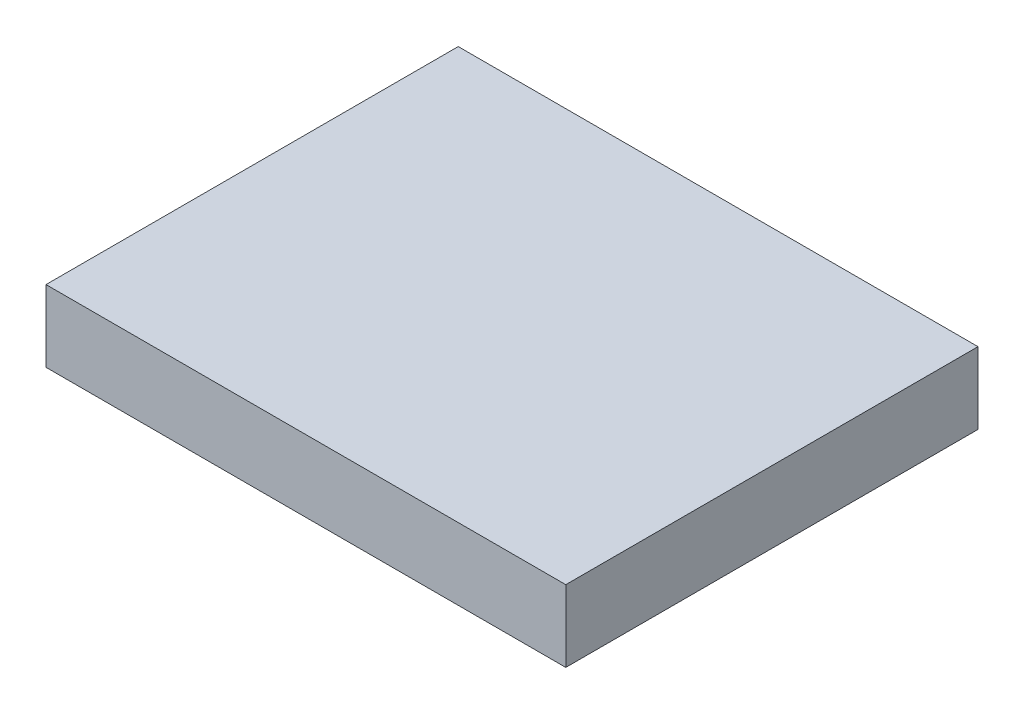
ISO-10303-21;
HEADER;
FILE_DESCRIPTION(('STEP AP214'),'2;1');
FILE_NAME('part.step','',(''),(''),'','','');
FILE_SCHEMA(('AUTOMOTIVE_DESIGN { 1 0 10303 214 1 1 1 1 }'));
ENDSEC;
DATA;
#1=APPLICATION_CONTEXT('core data for automotive mechanical design processes');
#2=APPLICATION_PROTOCOL_DEFINITION('international standard','automotive_design',2000,#1);
#3=PRODUCT_CONTEXT('',#1,'mechanical');
#4=PRODUCT('Part','Part','',(#3));
#5=PRODUCT_RELATED_PRODUCT_CATEGORY('part','',(#4));
#6=PRODUCT_DEFINITION_FORMATION('','',#4);
#7=PRODUCT_DEFINITION_CONTEXT('part definition',#1,'design');
#8=PRODUCT_DEFINITION('design','',#6,#7);
#9=PRODUCT_DEFINITION_SHAPE('','',#8);
#10=(LENGTH_UNIT() NAMED_UNIT(*) SI_UNIT(.MILLI.,.METRE.));
#11=(NAMED_UNIT(*) PLANE_ANGLE_UNIT() SI_UNIT($,.RADIAN.));
#12=(NAMED_UNIT(*) SI_UNIT($,.STERADIAN.) SOLID_ANGLE_UNIT());
#13=UNCERTAINTY_MEASURE_WITH_UNIT(LENGTH_MEASURE(1.E-05),#10,'distance_accuracy_value','');
#14=(GEOMETRIC_REPRESENTATION_CONTEXT(3) GLOBAL_UNCERTAINTY_ASSIGNED_CONTEXT((#13)) GLOBAL_UNIT_ASSIGNED_CONTEXT((#10,
#11,#12)) REPRESENTATION_CONTEXT('',''));
#15=CARTESIAN_POINT('',(0.,0.,0.));
#16=DIRECTION('',(0.,0.,1.));
#17=DIRECTION('',(1.,0.,0.));
#18=AXIS2_PLACEMENT_3D('',#15,#16,#17);
#19=CARTESIAN_POINT('',(0.,3.705,0.));
#20=DIRECTION('',(0.,1.,0.));
#21=DIRECTION('',(1.,0.,0.));
#22=AXIS2_PLACEMENT_3D('',#19,#20,#21);
#23=PLANE('',#22);
#24=DIRECTION('',(0.,0.,1.));
#25=VECTOR('',#24,1.);
#26=CARTESIAN_POINT('',(-15.818,3.705,0.));
#27=LINE('',#26,#25);
#28=CARTESIAN_POINT('',(-15.818,3.705,-1.389));
#29=VERTEX_POINT('',#28);
#30=CARTESIAN_POINT('',(-15.818,3.705,0.911));
#31=VERTEX_POINT('',#30);
#32=EDGE_CURVE('E11',#29,#31,#27,.T.);
#33=ORIENTED_EDGE('',*,*,#32,.T.);
#34=DIRECTION('',(1.,0.,0.));
#35=VECTOR('',#34,1.);
#36=CARTESIAN_POINT('',(0.,3.705,0.911));
#37=LINE('',#36,#35);
#38=CARTESIAN_POINT('',(-12.918,3.705,0.911));
#39=VERTEX_POINT('',#38);
#40=EDGE_CURVE('E24',#31,#39,#37,.T.);
#41=ORIENTED_EDGE('',*,*,#40,.T.);
#42=DIRECTION('',(0.,0.,-1.));
#43=VECTOR('',#42,1.);
#44=CARTESIAN_POINT('',(-12.918,3.705,0.));
#45=LINE('',#44,#43);
#46=CARTESIAN_POINT('',(-12.918,3.705,-1.389));
#47=VERTEX_POINT('',#46);
#48=EDGE_CURVE('E88',#39,#47,#45,.T.);
#49=ORIENTED_EDGE('',*,*,#48,.T.);
#50=DIRECTION('',(-1.,0.,0.));
#51=VECTOR('',#50,1.);
#52=CARTESIAN_POINT('',(0.,3.705,-1.389));
#53=LINE('',#52,#51);
#54=EDGE_CURVE('E59',#47,#29,#53,.T.);
#55=ORIENTED_EDGE('',*,*,#54,.T.);
#56=EDGE_LOOP('',(#33,#41,#49,#55));
#57=FACE_BOUND('',#56,.T.);
#58=ADVANCED_FACE('F17',(#57),#23,.T.);
#59=CARTESIAN_POINT('',(-15.818,3.705,0.911));
#60=DIRECTION('',(0.,0.,-1.));
#61=DIRECTION('',(0.,-1.,0.));
#62=AXIS2_PLACEMENT_3D('',#59,#60,#61);
#63=PLANE('',#62);
#64=DIRECTION('',(0.,-1.,0.));
#65=VECTOR('',#64,1.);
#66=CARTESIAN_POINT('',(-12.918,3.705,0.911));
#67=LINE('',#66,#65);
#68=CARTESIAN_POINT('',(-12.918,3.305,0.911));
#69=VERTEX_POINT('',#68);
#70=EDGE_CURVE('E75',#39,#69,#67,.T.);
#71=ORIENTED_EDGE('',*,*,#70,.F.);
#72=ORIENTED_EDGE('',*,*,#40,.F.);
#73=DIRECTION('',(0.,1.,0.));
#74=VECTOR('',#73,1.);
#75=CARTESIAN_POINT('',(-15.818,3.705,0.911));
#76=LINE('',#75,#74);
#77=CARTESIAN_POINT('',(-15.818,3.305,0.911));
#78=VERTEX_POINT('',#77);
#79=EDGE_CURVE('E84',#78,#31,#76,.T.);
#80=ORIENTED_EDGE('',*,*,#79,.F.);
#81=DIRECTION('',(-1.,0.,0.));
#82=VECTOR('',#81,1.);
#83=CARTESIAN_POINT('',(-15.818,3.305,0.911));
#84=LINE('',#83,#82);
#85=EDGE_CURVE('E82',#69,#78,#84,.T.);
#86=ORIENTED_EDGE('',*,*,#85,.F.);
#87=EDGE_LOOP('',(#71,#72,#80,#86));
#88=FACE_BOUND('',#87,.T.);
#89=ADVANCED_FACE('F90',(#88),#63,.F.);
#90=CARTESIAN_POINT('',(-15.818,3.705,-1.389));
#91=DIRECTION('',(1.,0.,0.));
#92=DIRECTION('',(0.,1.,0.));
#93=AXIS2_PLACEMENT_3D('',#90,#91,#92);
#94=PLANE('',#93);
#95=ORIENTED_EDGE('',*,*,#79,.T.);
#96=ORIENTED_EDGE('',*,*,#32,.F.);
#97=DIRECTION('',(0.,1.,0.));
#98=VECTOR('',#97,1.);
#99=CARTESIAN_POINT('',(-15.818,3.705,-1.389));
#100=LINE('',#99,#98);
#101=CARTESIAN_POINT('',(-15.818,3.305,-1.389));
#102=VERTEX_POINT('',#101);
#103=EDGE_CURVE('E80',#102,#29,#100,.T.);
#104=ORIENTED_EDGE('',*,*,#103,.F.);
#105=DIRECTION('',(0.,0.,-1.));
#106=VECTOR('',#105,1.);
#107=CARTESIAN_POINT('',(-15.818,3.305,-1.389));
#108=LINE('',#107,#106);
#109=EDGE_CURVE('E63',#78,#102,#108,.T.);
#110=ORIENTED_EDGE('',*,*,#109,.F.);
#111=EDGE_LOOP('',(#95,#96,#104,#110));
#112=FACE_BOUND('',#111,.T.);
#113=ADVANCED_FACE('F91',(#112),#94,.F.);
#114=CARTESIAN_POINT('',(-12.918,3.705,-1.389));
#115=DIRECTION('',(0.,0.,1.));
#116=DIRECTION('',(1.,0.,0.));
#117=AXIS2_PLACEMENT_3D('',#114,#115,#116);
#118=PLANE('',#117);
#119=ORIENTED_EDGE('',*,*,#103,.T.);
#120=ORIENTED_EDGE('',*,*,#54,.F.);
#121=DIRECTION('',(0.,1.,0.));
#122=VECTOR('',#121,1.);
#123=CARTESIAN_POINT('',(-12.918,3.705,-1.389));
#124=LINE('',#123,#122);
#125=CARTESIAN_POINT('',(-12.918,3.305,-1.389));
#126=VERTEX_POINT('',#125);
#127=EDGE_CURVE('E54',#126,#47,#124,.T.);
#128=ORIENTED_EDGE('',*,*,#127,.F.);
#129=DIRECTION('',(1.,0.,0.));
#130=VECTOR('',#129,1.);
#131=CARTESIAN_POINT('',(-12.918,3.305,-1.389));
#132=LINE('',#131,#130);
#133=EDGE_CURVE('E58',#102,#126,#132,.T.);
#134=ORIENTED_EDGE('',*,*,#133,.F.);
#135=EDGE_LOOP('',(#119,#120,#128,#134));
#136=FACE_BOUND('',#135,.T.);
#137=ADVANCED_FACE('F57',(#136),#118,.F.);
#138=CARTESIAN_POINT('',(-12.918,3.705,0.911));
#139=DIRECTION('',(-1.,0.,0.));
#140=DIRECTION('',(0.,0.,1.));
#141=AXIS2_PLACEMENT_3D('',#138,#139,#140);
#142=PLANE('',#141);
#143=ORIENTED_EDGE('',*,*,#127,.T.);
#144=ORIENTED_EDGE('',*,*,#48,.F.);
#145=ORIENTED_EDGE('',*,*,#70,.T.);
#146=DIRECTION('',(0.,0.,1.));
#147=VECTOR('',#146,1.);
#148=CARTESIAN_POINT('',(-12.918,3.305,0.911));
#149=LINE('',#148,#147);
#150=EDGE_CURVE('E70',#126,#69,#149,.T.);
#151=ORIENTED_EDGE('',*,*,#150,.F.);
#152=EDGE_LOOP('',(#143,#144,#145,#151));
#153=FACE_BOUND('',#152,.T.);
#154=ADVANCED_FACE('F73',(#153),#142,.F.);
#155=CARTESIAN_POINT('',(0.,3.305,0.));
#156=DIRECTION('',(0.,1.,0.));
#157=DIRECTION('',(1.,0.,0.));
#158=AXIS2_PLACEMENT_3D('',#155,#156,#157);
#159=PLANE('',#158);
#160=ORIENTED_EDGE('',*,*,#85,.T.);
#161=ORIENTED_EDGE('',*,*,#109,.T.);
#162=ORIENTED_EDGE('',*,*,#133,.T.);
#163=ORIENTED_EDGE('',*,*,#150,.T.);
#164=EDGE_LOOP('',(#160,#161,#162,#163));
#165=FACE_BOUND('',#164,.T.);
#166=ADVANCED_FACE('F69',(#165),#159,.F.);
#167=CLOSED_SHELL('',(#58,#89,#113,#137,#154,#166));
#168=MANIFOLD_SOLID_BREP('B1',#167);
#169=ADVANCED_BREP_SHAPE_REPRESENTATION('',(#18,#168),#14);
#170=SHAPE_DEFINITION_REPRESENTATION(#9,#169);
ENDSEC;
END-ISO-10303-21;
